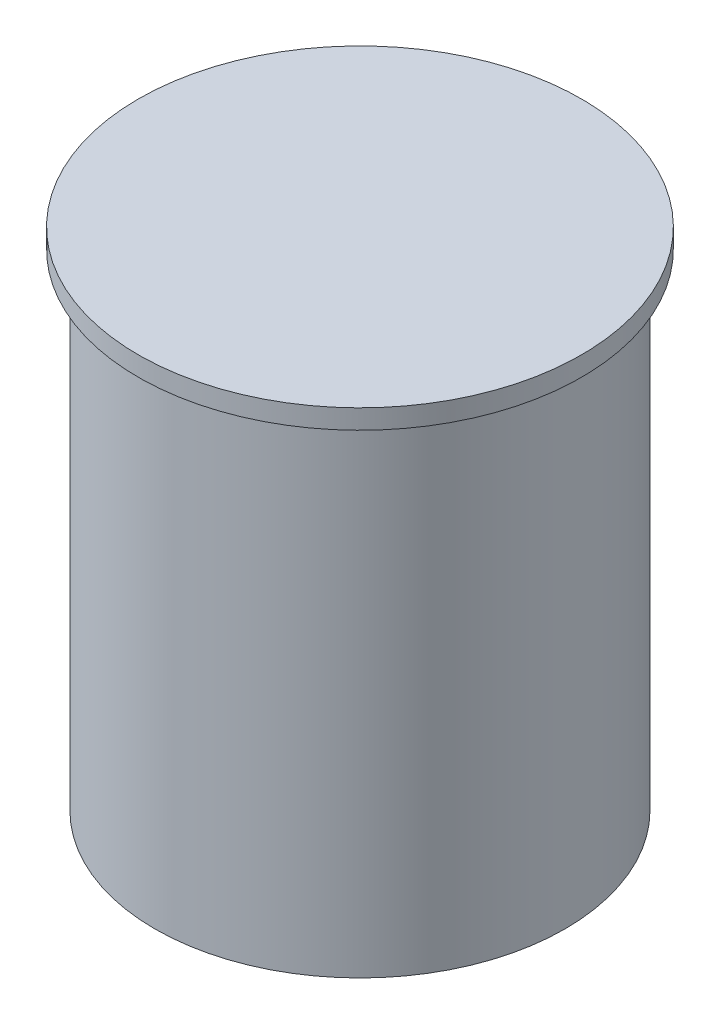
ISO-10303-21;
HEADER;
FILE_DESCRIPTION(('STEP AP214'),'2;1');
FILE_NAME('part.step','',(''),(''),'','','');
FILE_SCHEMA(('AUTOMOTIVE_DESIGN { 1 0 10303 214 1 1 1 1 }'));
ENDSEC;
DATA;
#1=APPLICATION_CONTEXT('core data for automotive mechanical design processes');
#2=APPLICATION_PROTOCOL_DEFINITION('international standard','automotive_design',2000,#1);
#3=PRODUCT_CONTEXT('',#1,'mechanical');
#4=PRODUCT('Part','Part','',(#3));
#5=PRODUCT_RELATED_PRODUCT_CATEGORY('part','',(#4));
#6=PRODUCT_DEFINITION_FORMATION('','',#4);
#7=PRODUCT_DEFINITION_CONTEXT('part definition',#1,'design');
#8=PRODUCT_DEFINITION('design','',#6,#7);
#9=PRODUCT_DEFINITION_SHAPE('','',#8);
#10=(LENGTH_UNIT() NAMED_UNIT(*) SI_UNIT(.MILLI.,.METRE.));
#11=(NAMED_UNIT(*) PLANE_ANGLE_UNIT() SI_UNIT($,.RADIAN.));
#12=(NAMED_UNIT(*) SI_UNIT($,.STERADIAN.) SOLID_ANGLE_UNIT());
#13=UNCERTAINTY_MEASURE_WITH_UNIT(LENGTH_MEASURE(1.E-05),#10,'distance_accuracy_value','');
#14=(GEOMETRIC_REPRESENTATION_CONTEXT(3) GLOBAL_UNCERTAINTY_ASSIGNED_CONTEXT((#13)) GLOBAL_UNIT_ASSIGNED_CONTEXT((#10,
#11,#12)) REPRESENTATION_CONTEXT('',''));
#15=CARTESIAN_POINT('',(0.,0.,0.));
#16=DIRECTION('',(0.,0.,1.));
#17=DIRECTION('',(1.,0.,0.));
#18=AXIS2_PLACEMENT_3D('',#15,#16,#17);
#19=CARTESIAN_POINT('',(0.,-66.04,0.));
#20=DIRECTION('',(0.,1.,0.));
#21=DIRECTION('',(-1.,0.,0.));
#22=AXIS2_PLACEMENT_3D('',#19,#20,#21);
#23=PLANE('',#22);
#24=CARTESIAN_POINT('',(0.,-66.04,0.));
#25=DIRECTION('',(0.,1.,0.));
#26=DIRECTION('',(-1.,0.,0.));
#27=AXIS2_PLACEMENT_3D('',#24,#25,#26);
#28=CIRCLE('',#27,26.797);
#29=CARTESIAN_POINT('',(-26.797,-66.04,0.));
#30=VERTEX_POINT('',#29);
#31=EDGE_CURVE('E50',#30,#30,#28,.T.);
#32=ORIENTED_EDGE('',*,*,#31,.F.);
#33=EDGE_LOOP('',(#32));
#34=FACE_BOUND('',#33,.T.);
#35=ADVANCED_FACE('F38',(#34),#23,.F.);
#36=CARTESIAN_POINT('',(0.,0.,0.));
#37=DIRECTION('',(0.,1.,0.));
#38=DIRECTION('',(-1.,0.,0.));
#39=AXIS2_PLACEMENT_3D('',#36,#37,#38);
#40=CYLINDRICAL_SURFACE('',#39,26.797);
#41=CARTESIAN_POINT('',(0.,-2.54,0.));
#42=DIRECTION('',(0.,1.,0.));
#43=DIRECTION('',(-1.,0.,0.));
#44=AXIS2_PLACEMENT_3D('',#41,#42,#43);
#45=CIRCLE('',#44,26.797);
#46=CARTESIAN_POINT('',(-26.797,-2.54000000000001,0.));
#47=VERTEX_POINT('',#46);
#48=EDGE_CURVE('E54',#47,#47,#45,.T.);
#49=ORIENTED_EDGE('',*,*,#48,.F.);
#50=EDGE_LOOP('',(#49));
#51=FACE_BOUND('',#50,.T.);
#52=ORIENTED_EDGE('',*,*,#31,.T.);
#53=EDGE_LOOP('',(#52));
#54=FACE_BOUND('',#53,.T.);
#55=ADVANCED_FACE('F77',(#51,#54),#40,.T.);
#56=CARTESIAN_POINT('',(26.797,-2.54,0.));
#57=DIRECTION('',(0.,1.,0.));
#58=DIRECTION('',(-1.,0.,0.));
#59=AXIS2_PLACEMENT_3D('',#56,#57,#58);
#60=PLANE('',#59);
#61=CARTESIAN_POINT('',(0.,-2.54,0.));
#62=DIRECTION('',(0.,1.,0.));
#63=DIRECTION('',(-1.,0.,0.));
#64=AXIS2_PLACEMENT_3D('',#61,#62,#63);
#65=CIRCLE('',#64,28.956);
#66=CARTESIAN_POINT('',(-28.956,-2.54000000000001,0.));
#67=VERTEX_POINT('',#66);
#68=EDGE_CURVE('E59',#67,#67,#65,.T.);
#69=ORIENTED_EDGE('',*,*,#68,.F.);
#70=EDGE_LOOP('',(#69));
#71=FACE_BOUND('',#70,.T.);
#72=ORIENTED_EDGE('',*,*,#48,.T.);
#73=EDGE_LOOP('',(#72));
#74=FACE_BOUND('',#73,.T.);
#75=ADVANCED_FACE('F71',(#71,#74),#60,.F.);
#76=CARTESIAN_POINT('',(0.,0.,0.));
#77=DIRECTION('',(0.,1.,0.));
#78=DIRECTION('',(-1.,0.,0.));
#79=AXIS2_PLACEMENT_3D('',#76,#77,#78);
#80=CYLINDRICAL_SURFACE('',#79,28.956);
#81=CARTESIAN_POINT('',(0.,0.,0.));
#82=DIRECTION('',(0.,1.,0.));
#83=DIRECTION('',(-1.,0.,0.));
#84=AXIS2_PLACEMENT_3D('',#81,#82,#83);
#85=CIRCLE('',#84,28.956);
#86=CARTESIAN_POINT('',(-28.956,0.,0.));
#87=VERTEX_POINT('',#86);
#88=EDGE_CURVE('E62',#87,#87,#85,.T.);
#89=ORIENTED_EDGE('',*,*,#88,.F.);
#90=EDGE_LOOP('',(#89));
#91=FACE_BOUND('',#90,.T.);
#92=ORIENTED_EDGE('',*,*,#68,.T.);
#93=EDGE_LOOP('',(#92));
#94=FACE_BOUND('',#93,.T.);
#95=ADVANCED_FACE('F68',(#91,#94),#80,.T.);
#96=CARTESIAN_POINT('',(0.,0.,0.));
#97=DIRECTION('',(0.,-1.,0.));
#98=DIRECTION('',(1.,0.,0.));
#99=AXIS2_PLACEMENT_3D('',#96,#97,#98);
#100=PLANE('',#99);
#101=ORIENTED_EDGE('',*,*,#88,.T.);
#102=EDGE_LOOP('',(#101));
#103=FACE_BOUND('',#102,.T.);
#104=ADVANCED_FACE('F66',(#103),#100,.F.);
#105=CLOSED_SHELL('',(#35,#55,#75,#95,#104));
#106=CARTESIAN_POINT('',(0.,-2.54,0.));
#107=DIRECTION('',(0.,1.,0.));
#108=DIRECTION('',(-1.,0.,0.));
#109=AXIS2_PLACEMENT_3D('',#106,#107,#108);
#110=PLANE('',#109);
#111=CARTESIAN_POINT('',(0.,-2.54,0.));
#112=DIRECTION('',(0.,1.,0.));
#113=DIRECTION('',(-1.,0.,0.));
#114=AXIS2_PLACEMENT_3D('',#111,#112,#113);
#115=CIRCLE('',#114,24.257);
#116=CARTESIAN_POINT('',(-24.257,-2.54000000000001,0.));
#117=VERTEX_POINT('',#116);
#118=EDGE_CURVE('E10',#117,#117,#115,.T.);
#119=ORIENTED_EDGE('',*,*,#118,.F.);
#120=EDGE_LOOP('',(#119));
#121=FACE_BOUND('',#120,.T.);
#122=ADVANCED_FACE('F40',(#121),#110,.F.);
#123=CARTESIAN_POINT('',(0.,0.,0.));
#124=DIRECTION('',(0.,1.,0.));
#125=DIRECTION('',(-1.,0.,0.));
#126=AXIS2_PLACEMENT_3D('',#123,#124,#125);
#127=CYLINDRICAL_SURFACE('',#126,24.257);
#128=CARTESIAN_POINT('',(0.,-63.5,0.));
#129=DIRECTION('',(0.,1.,0.));
#130=DIRECTION('',(-1.,0.,0.));
#131=AXIS2_PLACEMENT_3D('',#128,#129,#130);
#132=CIRCLE('',#131,24.257);
#133=CARTESIAN_POINT('',(-24.257,-63.5,0.));
#134=VERTEX_POINT('',#133);
#135=EDGE_CURVE('E46',#134,#134,#132,.T.);
#136=ORIENTED_EDGE('',*,*,#135,.F.);
#137=EDGE_LOOP('',(#136));
#138=FACE_BOUND('',#137,.T.);
#139=ORIENTED_EDGE('',*,*,#118,.T.);
#140=EDGE_LOOP('',(#139));
#141=FACE_BOUND('',#140,.T.);
#142=ADVANCED_FACE('F93',(#138,#141),#127,.F.);
#143=CARTESIAN_POINT('',(0.,-63.5,0.));
#144=DIRECTION('',(0.,-1.,0.));
#145=DIRECTION('',(1.,0.,0.));
#146=AXIS2_PLACEMENT_3D('',#143,#144,#145);
#147=PLANE('',#146);
#148=ORIENTED_EDGE('',*,*,#135,.T.);
#149=EDGE_LOOP('',(#148));
#150=FACE_BOUND('',#149,.T.);
#151=ADVANCED_FACE('F91',(#150),#147,.F.);
#152=CLOSED_SHELL('',(#122,#142,#151));
#153=ORIENTED_CLOSED_SHELL('',*,#152,.T.);
#154=BREP_WITH_VOIDS('B2',#105,(#153));
#155=ADVANCED_BREP_SHAPE_REPRESENTATION('',(#18,#154),#14);
#156=SHAPE_DEFINITION_REPRESENTATION(#9,#155);
ENDSEC;
END-ISO-10303-21;
